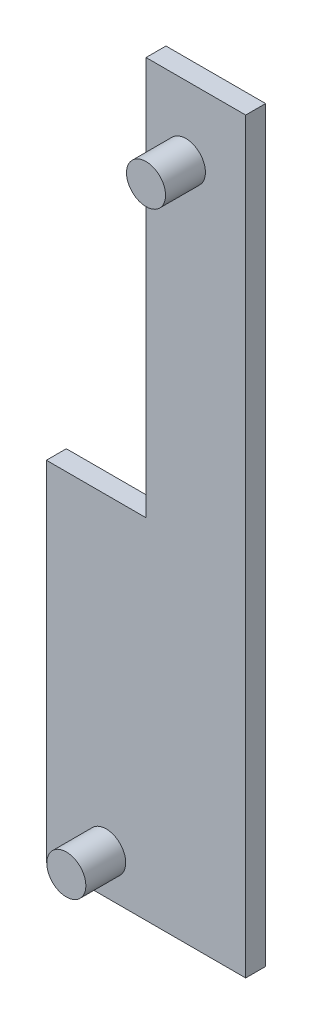
ISO-10303-21;
HEADER;
FILE_DESCRIPTION(('STEP AP214'),'2;1');
FILE_NAME('part.step','',(''),(''),'','','');
FILE_SCHEMA(('AUTOMOTIVE_DESIGN { 1 0 10303 214 1 1 1 1 }'));
ENDSEC;
DATA;
#1=APPLICATION_CONTEXT('core data for automotive mechanical design processes');
#2=APPLICATION_PROTOCOL_DEFINITION('international standard','automotive_design',2000,#1);
#3=PRODUCT_CONTEXT('',#1,'mechanical');
#4=PRODUCT('Part','Part','',(#3));
#5=PRODUCT_RELATED_PRODUCT_CATEGORY('part','',(#4));
#6=PRODUCT_DEFINITION_FORMATION('','',#4);
#7=PRODUCT_DEFINITION_CONTEXT('part definition',#1,'design');
#8=PRODUCT_DEFINITION('design','',#6,#7);
#9=PRODUCT_DEFINITION_SHAPE('','',#8);
#10=(LENGTH_UNIT() NAMED_UNIT(*) SI_UNIT(.MILLI.,.METRE.));
#11=(NAMED_UNIT(*) PLANE_ANGLE_UNIT() SI_UNIT($,.RADIAN.));
#12=(NAMED_UNIT(*) SI_UNIT($,.STERADIAN.) SOLID_ANGLE_UNIT());
#13=UNCERTAINTY_MEASURE_WITH_UNIT(LENGTH_MEASURE(1.E-05),#10,'distance_accuracy_value','');
#14=(GEOMETRIC_REPRESENTATION_CONTEXT(3) GLOBAL_UNCERTAINTY_ASSIGNED_CONTEXT((#13)) GLOBAL_UNIT_ASSIGNED_CONTEXT((#10,
#11,#12)) REPRESENTATION_CONTEXT('',''));
#15=CARTESIAN_POINT('',(0.,0.,0.));
#16=DIRECTION('',(0.,0.,1.));
#17=DIRECTION('',(1.,0.,0.));
#18=AXIS2_PLACEMENT_3D('',#15,#16,#17);
#19=CARTESIAN_POINT('',(0.,0.,5.));
#20=DIRECTION('',(1.,0.,0.));
#21=DIRECTION('',(0.,1.,0.));
#22=AXIS2_PLACEMENT_3D('',#19,#20,#21);
#23=PLANE('',#22);
#24=DIRECTION('',(0.,-1.,0.));
#25=VECTOR('',#24,1.);
#26=CARTESIAN_POINT('',(0.,0.,5.));
#27=LINE('',#26,#25);
#28=CARTESIAN_POINT('',(0.,87.5,5.));
#29=VERTEX_POINT('',#28);
#30=CARTESIAN_POINT('',(0.,0.,5.));
#31=VERTEX_POINT('',#30);
#32=EDGE_CURVE('E76',#29,#31,#27,.T.);
#33=ORIENTED_EDGE('',*,*,#32,.F.);
#34=DIRECTION('',(0.,0.,1.));
#35=VECTOR('',#34,1.);
#36=CARTESIAN_POINT('',(0.,87.5,-5.));
#37=LINE('',#36,#35);
#38=CARTESIAN_POINT('',(0.,87.5,0.));
#39=VERTEX_POINT('',#38);
#40=EDGE_CURVE('E91',#39,#29,#37,.T.);
#41=ORIENTED_EDGE('',*,*,#40,.F.);
#42=DIRECTION('',(0.,-1.,0.));
#43=VECTOR('',#42,1.);
#44=CARTESIAN_POINT('',(0.,0.,0.));
#45=LINE('',#44,#43);
#46=CARTESIAN_POINT('',(0.,0.,0.));
#47=VERTEX_POINT('',#46);
#48=EDGE_CURVE('E119',#39,#47,#45,.T.);
#49=ORIENTED_EDGE('',*,*,#48,.T.);
#50=DIRECTION('',(0.,0.,-1.));
#51=VECTOR('',#50,1.);
#52=CARTESIAN_POINT('',(0.,0.,5.));
#53=LINE('',#52,#51);
#54=EDGE_CURVE('E104',#31,#47,#53,.T.);
#55=ORIENTED_EDGE('',*,*,#54,.F.);
#56=EDGE_LOOP('',(#33,#41,#49,#55));
#57=FACE_BOUND('',#56,.T.);
#58=ADVANCED_FACE('F32',(#57),#23,.F.);
#59=CARTESIAN_POINT('',(0.,0.,5.));
#60=DIRECTION('',(0.,1.,0.));
#61=DIRECTION('',(0.,0.,1.));
#62=AXIS2_PLACEMENT_3D('',#59,#60,#61);
#63=PLANE('',#62);
#64=DIRECTION('',(1.,0.,0.));
#65=VECTOR('',#64,1.);
#66=CARTESIAN_POINT('',(0.,0.,0.));
#67=LINE('',#66,#65);
#68=CARTESIAN_POINT('',(50.,0.,0.));
#69=VERTEX_POINT('',#68);
#70=EDGE_CURVE('E121',#47,#69,#67,.T.);
#71=ORIENTED_EDGE('',*,*,#70,.T.);
#72=DIRECTION('',(0.,0.,-1.));
#73=VECTOR('',#72,1.);
#74=CARTESIAN_POINT('',(50.,0.,5.));
#75=LINE('',#74,#73);
#76=CARTESIAN_POINT('',(50.,0.,5.));
#77=VERTEX_POINT('',#76);
#78=EDGE_CURVE('E125',#77,#69,#75,.T.);
#79=ORIENTED_EDGE('',*,*,#78,.F.);
#80=DIRECTION('',(1.,0.,0.));
#81=VECTOR('',#80,1.);
#82=CARTESIAN_POINT('',(0.,0.,5.));
#83=LINE('',#82,#81);
#84=EDGE_CURVE('E105',#31,#77,#83,.T.);
#85=ORIENTED_EDGE('',*,*,#84,.F.);
#86=ORIENTED_EDGE('',*,*,#54,.T.);
#87=EDGE_LOOP('',(#71,#79,#85,#86));
#88=FACE_BOUND('',#87,.T.);
#89=ADVANCED_FACE('F159',(#88),#63,.F.);
#90=CARTESIAN_POINT('',(50.,0.,5.));
#91=DIRECTION('',(-1.,0.,0.));
#92=DIRECTION('',(0.,-1.,0.));
#93=AXIS2_PLACEMENT_3D('',#90,#91,#92);
#94=PLANE('',#93);
#95=DIRECTION('',(0.,1.,0.));
#96=VECTOR('',#95,1.);
#97=CARTESIAN_POINT('',(50.,0.,0.));
#98=LINE('',#97,#96);
#99=CARTESIAN_POINT('',(50.,187.5,0.));
#100=VERTEX_POINT('',#99);
#101=EDGE_CURVE('E71',#69,#100,#98,.T.);
#102=ORIENTED_EDGE('',*,*,#101,.T.);
#103=DIRECTION('',(0.,0.,-1.));
#104=VECTOR('',#103,1.);
#105=CARTESIAN_POINT('',(50.,187.5,5.));
#106=LINE('',#105,#104);
#107=CARTESIAN_POINT('',(50.,187.5,5.));
#108=VERTEX_POINT('',#107);
#109=EDGE_CURVE('E118',#108,#100,#106,.T.);
#110=ORIENTED_EDGE('',*,*,#109,.F.);
#111=DIRECTION('',(0.,1.,0.));
#112=VECTOR('',#111,1.);
#113=CARTESIAN_POINT('',(50.,0.,5.));
#114=LINE('',#113,#112);
#115=EDGE_CURVE('E54',#77,#108,#114,.T.);
#116=ORIENTED_EDGE('',*,*,#115,.F.);
#117=ORIENTED_EDGE('',*,*,#78,.T.);
#118=EDGE_LOOP('',(#102,#110,#116,#117));
#119=FACE_BOUND('',#118,.T.);
#120=ADVANCED_FACE('F163',(#119),#94,.F.);
#121=CARTESIAN_POINT('',(0.,187.5,5.));
#122=DIRECTION('',(0.,-1.,0.));
#123=DIRECTION('',(0.,0.,-1.));
#124=AXIS2_PLACEMENT_3D('',#121,#122,#123);
#125=PLANE('',#124);
#126=DIRECTION('',(-1.,0.,0.));
#127=VECTOR('',#126,1.);
#128=CARTESIAN_POINT('',(0.,187.5,0.));
#129=LINE('',#128,#127);
#130=CARTESIAN_POINT('',(25.,187.5,0.));
#131=VERTEX_POINT('',#130);
#132=EDGE_CURVE('E106',#100,#131,#129,.T.);
#133=ORIENTED_EDGE('',*,*,#132,.T.);
#134=DIRECTION('',(0.,0.,1.));
#135=VECTOR('',#134,1.);
#136=CARTESIAN_POINT('',(25.,187.5,-5.));
#137=LINE('',#136,#135);
#138=CARTESIAN_POINT('',(25.,187.5,5.));
#139=VERTEX_POINT('',#138);
#140=EDGE_CURVE('E177',#131,#139,#137,.T.);
#141=ORIENTED_EDGE('',*,*,#140,.T.);
#142=DIRECTION('',(-1.,0.,0.));
#143=VECTOR('',#142,1.);
#144=CARTESIAN_POINT('',(0.,187.5,5.));
#145=LINE('',#144,#143);
#146=EDGE_CURVE('E116',#108,#139,#145,.T.);
#147=ORIENTED_EDGE('',*,*,#146,.F.);
#148=ORIENTED_EDGE('',*,*,#109,.T.);
#149=EDGE_LOOP('',(#133,#141,#147,#148));
#150=FACE_BOUND('',#149,.T.);
#151=ADVANCED_FACE('F140',(#150),#125,.F.);
#152=CARTESIAN_POINT('',(0.,0.,5.));
#153=DIRECTION('',(0.,0.,-1.));
#154=DIRECTION('',(-1.,0.,0.));
#155=AXIS2_PLACEMENT_3D('',#152,#153,#154);
#156=PLANE('',#155);
#157=CARTESIAN_POINT('',(35.,170.,5.));
#158=DIRECTION('',(0.,0.,-1.));
#159=DIRECTION('',(-1.,0.,0.));
#160=AXIS2_PLACEMENT_3D('',#157,#158,#159);
#161=CIRCLE('',#160,4.89999999999998);
#162=CARTESIAN_POINT('',(30.1,170.,5.));
#163=VERTEX_POINT('',#162);
#164=EDGE_CURVE('E131',#163,#163,#161,.F.);
#165=ORIENTED_EDGE('',*,*,#164,.F.);
#166=EDGE_LOOP('',(#165));
#167=FACE_BOUND('',#166,.T.);
#168=CARTESIAN_POINT('',(15.,10.,5.));
#169=DIRECTION('',(0.,0.,-1.));
#170=DIRECTION('',(-1.,0.,0.));
#171=AXIS2_PLACEMENT_3D('',#168,#169,#170);
#172=CIRCLE('',#171,4.9);
#173=CARTESIAN_POINT('',(10.1,10.,5.));
#174=VERTEX_POINT('',#173);
#175=EDGE_CURVE('E128',#174,#174,#172,.F.);
#176=ORIENTED_EDGE('',*,*,#175,.F.);
#177=EDGE_LOOP('',(#176));
#178=FACE_BOUND('',#177,.T.);
#179=ORIENTED_EDGE('',*,*,#146,.T.);
#180=DIRECTION('',(0.,1.,0.));
#181=VECTOR('',#180,1.);
#182=CARTESIAN_POINT('',(25.,187.5,5.));
#183=LINE('',#182,#181);
#184=CARTESIAN_POINT('',(25.,87.5,5.));
#185=VERTEX_POINT('',#184);
#186=EDGE_CURVE('E98',#185,#139,#183,.T.);
#187=ORIENTED_EDGE('',*,*,#186,.F.);
#188=DIRECTION('',(1.,0.,0.));
#189=VECTOR('',#188,1.);
#190=CARTESIAN_POINT('',(0.,87.5,5.));
#191=LINE('',#190,#189);
#192=EDGE_CURVE('E93',#29,#185,#191,.T.);
#193=ORIENTED_EDGE('',*,*,#192,.F.);
#194=ORIENTED_EDGE('',*,*,#32,.T.);
#195=ORIENTED_EDGE('',*,*,#84,.T.);
#196=ORIENTED_EDGE('',*,*,#115,.T.);
#197=EDGE_LOOP('',(#179,#187,#193,#194,#195,#196));
#198=FACE_BOUND('',#197,.T.);
#199=ADVANCED_FACE('F100',(#167,#178,#198),#156,.F.);
#200=CARTESIAN_POINT('',(0.,0.,0.));
#201=DIRECTION('',(0.,0.,-1.));
#202=DIRECTION('',(-1.,0.,0.));
#203=AXIS2_PLACEMENT_3D('',#200,#201,#202);
#204=PLANE('',#203);
#205=DIRECTION('',(0.,-1.,0.));
#206=VECTOR('',#205,1.);
#207=CARTESIAN_POINT('',(25.,0.,0.));
#208=LINE('',#207,#206);
#209=CARTESIAN_POINT('',(25.,87.5,0.));
#210=VERTEX_POINT('',#209);
#211=EDGE_CURVE('E11',#131,#210,#208,.T.);
#212=ORIENTED_EDGE('',*,*,#211,.F.);
#213=ORIENTED_EDGE('',*,*,#132,.F.);
#214=ORIENTED_EDGE('',*,*,#101,.F.);
#215=ORIENTED_EDGE('',*,*,#70,.F.);
#216=ORIENTED_EDGE('',*,*,#48,.F.);
#217=DIRECTION('',(-1.,0.,0.));
#218=VECTOR('',#217,1.);
#219=CARTESIAN_POINT('',(0.,87.5,0.));
#220=LINE('',#219,#218);
#221=EDGE_CURVE('E39',#210,#39,#220,.T.);
#222=ORIENTED_EDGE('',*,*,#221,.F.);
#223=EDGE_LOOP('',(#212,#213,#214,#215,#216,#222));
#224=FACE_BOUND('',#223,.T.);
#225=ADVANCED_FACE('F139',(#224),#204,.T.);
#226=CARTESIAN_POINT('',(15.,10.,15.));
#227=DIRECTION('',(0.,0.,-1.));
#228=DIRECTION('',(-1.,0.,0.));
#229=AXIS2_PLACEMENT_3D('',#226,#227,#228);
#230=CYLINDRICAL_SURFACE('',#229,4.9);
#231=CARTESIAN_POINT('',(15.,10.,15.));
#232=DIRECTION('',(0.,0.,1.));
#233=DIRECTION('',(1.,0.,0.));
#234=AXIS2_PLACEMENT_3D('',#231,#232,#233);
#235=CIRCLE('',#234,4.9);
#236=CARTESIAN_POINT('',(19.9,10.,15.));
#237=VERTEX_POINT('',#236);
#238=EDGE_CURVE('E112',#237,#237,#235,.T.);
#239=ORIENTED_EDGE('',*,*,#238,.F.);
#240=EDGE_LOOP('',(#239));
#241=FACE_BOUND('',#240,.T.);
#242=ORIENTED_EDGE('',*,*,#175,.T.);
#243=EDGE_LOOP('',(#242));
#244=FACE_BOUND('',#243,.T.);
#245=ADVANCED_FACE('F144',(#241,#244),#230,.T.);
#246=CARTESIAN_POINT('',(15.,10.,15.));
#247=DIRECTION('',(0.,0.,1.));
#248=DIRECTION('',(1.,0.,0.));
#249=AXIS2_PLACEMENT_3D('',#246,#247,#248);
#250=PLANE('',#249);
#251=ORIENTED_EDGE('',*,*,#238,.T.);
#252=EDGE_LOOP('',(#251));
#253=FACE_BOUND('',#252,.T.);
#254=ADVANCED_FACE('F146',(#253),#250,.T.);
#255=CARTESIAN_POINT('',(35.,170.,15.));
#256=DIRECTION('',(0.,0.,-1.));
#257=DIRECTION('',(-1.,0.,0.));
#258=AXIS2_PLACEMENT_3D('',#255,#256,#257);
#259=CYLINDRICAL_SURFACE('',#258,4.89999999999998);
#260=CARTESIAN_POINT('',(35.,170.,15.));
#261=DIRECTION('',(0.,0.,1.));
#262=DIRECTION('',(1.,0.,0.));
#263=AXIS2_PLACEMENT_3D('',#260,#261,#262);
#264=CIRCLE('',#263,4.89999999999998);
#265=CARTESIAN_POINT('',(39.9,170.,15.));
#266=VERTEX_POINT('',#265);
#267=EDGE_CURVE('E182',#266,#266,#264,.T.);
#268=ORIENTED_EDGE('',*,*,#267,.F.);
#269=EDGE_LOOP('',(#268));
#270=FACE_BOUND('',#269,.T.);
#271=ORIENTED_EDGE('',*,*,#164,.T.);
#272=EDGE_LOOP('',(#271));
#273=FACE_BOUND('',#272,.T.);
#274=ADVANCED_FACE('F135',(#270,#273),#259,.T.);
#275=CARTESIAN_POINT('',(35.,170.,15.));
#276=DIRECTION('',(0.,0.,1.));
#277=DIRECTION('',(1.,0.,0.));
#278=AXIS2_PLACEMENT_3D('',#275,#276,#277);
#279=PLANE('',#278);
#280=ORIENTED_EDGE('',*,*,#267,.T.);
#281=EDGE_LOOP('',(#280));
#282=FACE_BOUND('',#281,.T.);
#283=ADVANCED_FACE('F190',(#282),#279,.T.);
#284=CARTESIAN_POINT('',(25.,187.5,-5.));
#285=DIRECTION('',(1.,0.,0.));
#286=DIRECTION('',(0.,1.,0.));
#287=AXIS2_PLACEMENT_3D('',#284,#285,#286);
#288=PLANE('',#287);
#289=ORIENTED_EDGE('',*,*,#211,.T.);
#290=DIRECTION('',(0.,0.,1.));
#291=VECTOR('',#290,1.);
#292=CARTESIAN_POINT('',(25.,87.5,-5.));
#293=LINE('',#292,#291);
#294=EDGE_CURVE('E46',#210,#185,#293,.T.);
#295=ORIENTED_EDGE('',*,*,#294,.T.);
#296=ORIENTED_EDGE('',*,*,#186,.T.);
#297=ORIENTED_EDGE('',*,*,#140,.F.);
#298=EDGE_LOOP('',(#289,#295,#296,#297));
#299=FACE_BOUND('',#298,.T.);
#300=ADVANCED_FACE('F181',(#299),#288,.F.);
#301=CARTESIAN_POINT('',(0.,87.5,-5.));
#302=DIRECTION('',(0.,-1.,0.));
#303=DIRECTION('',(0.,0.,-1.));
#304=AXIS2_PLACEMENT_3D('',#301,#302,#303);
#305=PLANE('',#304);
#306=ORIENTED_EDGE('',*,*,#221,.T.);
#307=ORIENTED_EDGE('',*,*,#40,.T.);
#308=ORIENTED_EDGE('',*,*,#192,.T.);
#309=ORIENTED_EDGE('',*,*,#294,.F.);
#310=EDGE_LOOP('',(#306,#307,#308,#309));
#311=FACE_BOUND('',#310,.T.);
#312=ADVANCED_FACE('F92',(#311),#305,.F.);
#313=CLOSED_SHELL('',(#58,#89,#120,#151,#199,#225,#245,#254,#274,#283,#300,#312));
#314=MANIFOLD_SOLID_BREP('B2',#313);
#315=ADVANCED_BREP_SHAPE_REPRESENTATION('',(#18,#314),#14);
#316=SHAPE_DEFINITION_REPRESENTATION(#9,#315);
ENDSEC;
END-ISO-10303-21;
